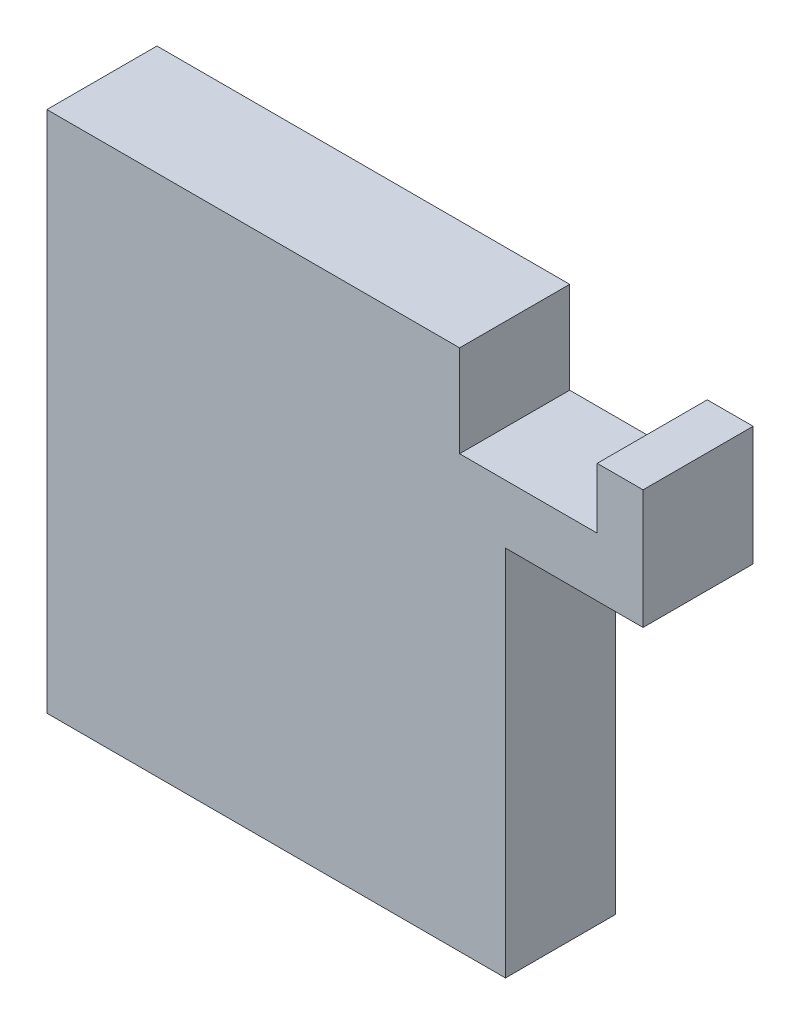
ISO-10303-21;
HEADER;
FILE_DESCRIPTION(('STEP AP214'),'2;1');
FILE_NAME('part.step','',(''),(''),'','','');
FILE_SCHEMA(('AUTOMOTIVE_DESIGN { 1 0 10303 214 1 1 1 1 }'));
ENDSEC;
DATA;
#1=APPLICATION_CONTEXT('core data for automotive mechanical design processes');
#2=APPLICATION_PROTOCOL_DEFINITION('international standard','automotive_design',2000,#1);
#3=PRODUCT_CONTEXT('',#1,'mechanical');
#4=PRODUCT('Part','Part','',(#3));
#5=PRODUCT_RELATED_PRODUCT_CATEGORY('part','',(#4));
#6=PRODUCT_DEFINITION_FORMATION('','',#4);
#7=PRODUCT_DEFINITION_CONTEXT('part definition',#1,'design');
#8=PRODUCT_DEFINITION('design','',#6,#7);
#9=PRODUCT_DEFINITION_SHAPE('','',#8);
#10=(LENGTH_UNIT() NAMED_UNIT(*) SI_UNIT(.MILLI.,.METRE.));
#11=(NAMED_UNIT(*) PLANE_ANGLE_UNIT() SI_UNIT($,.RADIAN.));
#12=(NAMED_UNIT(*) SI_UNIT($,.STERADIAN.) SOLID_ANGLE_UNIT());
#13=UNCERTAINTY_MEASURE_WITH_UNIT(LENGTH_MEASURE(1.E-05),#10,'distance_accuracy_value','');
#14=(GEOMETRIC_REPRESENTATION_CONTEXT(3) GLOBAL_UNCERTAINTY_ASSIGNED_CONTEXT((#13)) GLOBAL_UNIT_ASSIGNED_CONTEXT((#10,
#11,#12)) REPRESENTATION_CONTEXT('',''));
#15=CARTESIAN_POINT('',(0.,0.,0.));
#16=DIRECTION('',(0.,0.,1.));
#17=DIRECTION('',(1.,0.,0.));
#18=AXIS2_PLACEMENT_3D('',#15,#16,#17);
#19=CARTESIAN_POINT('',(3.4,10.5,1.2));
#20=DIRECTION('',(1.,0.,0.));
#21=DIRECTION('',(0.,1.,0.));
#22=AXIS2_PLACEMENT_3D('',#19,#20,#21);
#23=PLANE('',#22);
#24=DIRECTION('',(0.,-1.,0.));
#25=VECTOR('',#24,1.);
#26=CARTESIAN_POINT('',(3.4,10.5,0.));
#27=LINE('',#26,#25);
#28=CARTESIAN_POINT('',(3.4,10.5,0.));
#29=VERTEX_POINT('',#28);
#30=CARTESIAN_POINT('',(3.4,4.8,0.));
#31=VERTEX_POINT('',#30);
#32=EDGE_CURVE('E141',#29,#31,#27,.T.);
#33=ORIENTED_EDGE('',*,*,#32,.T.);
#34=DIRECTION('',(0.,0.,-1.));
#35=VECTOR('',#34,1.);
#36=CARTESIAN_POINT('',(3.4,4.8,1.2));
#37=LINE('',#36,#35);
#38=CARTESIAN_POINT('',(3.4,4.8,1.2));
#39=VERTEX_POINT('',#38);
#40=EDGE_CURVE('E11',#39,#31,#37,.T.);
#41=ORIENTED_EDGE('',*,*,#40,.F.);
#42=DIRECTION('',(0.,-1.,0.));
#43=VECTOR('',#42,1.);
#44=CARTESIAN_POINT('',(3.4,10.5,1.2));
#45=LINE('',#44,#43);
#46=CARTESIAN_POINT('',(3.4,10.5,1.2));
#47=VERTEX_POINT('',#46);
#48=EDGE_CURVE('E93',#47,#39,#45,.T.);
#49=ORIENTED_EDGE('',*,*,#48,.F.);
#50=DIRECTION('',(0.,0.,-1.));
#51=VECTOR('',#50,1.);
#52=CARTESIAN_POINT('',(3.4,10.5,1.2));
#53=LINE('',#52,#51);
#54=EDGE_CURVE('E50',#47,#29,#53,.T.);
#55=ORIENTED_EDGE('',*,*,#54,.T.);
#56=EDGE_LOOP('',(#33,#41,#49,#55));
#57=FACE_BOUND('',#56,.T.);
#58=ADVANCED_FACE('F34',(#57),#23,.F.);
#59=CARTESIAN_POINT('',(8.4,4.8,1.2));
#60=DIRECTION('',(0.,-1.,0.));
#61=DIRECTION('',(0.,0.,-1.));
#62=AXIS2_PLACEMENT_3D('',#59,#60,#61);
#63=PLANE('',#62);
#64=DIRECTION('',(-1.,0.,0.));
#65=VECTOR('',#64,1.);
#66=CARTESIAN_POINT('',(8.4,4.8,0.));
#67=LINE('',#66,#65);
#68=CARTESIAN_POINT('',(8.4,4.8,0.));
#69=VERTEX_POINT('',#68);
#70=EDGE_CURVE('E143',#69,#31,#67,.T.);
#71=ORIENTED_EDGE('',*,*,#70,.F.);
#72=DIRECTION('',(0.,0.,-1.));
#73=VECTOR('',#72,1.);
#74=CARTESIAN_POINT('',(8.4,4.8,1.2));
#75=LINE('',#74,#73);
#76=CARTESIAN_POINT('',(8.4,4.8,1.2));
#77=VERTEX_POINT('',#76);
#78=EDGE_CURVE('E42',#77,#69,#75,.T.);
#79=ORIENTED_EDGE('',*,*,#78,.F.);
#80=DIRECTION('',(-1.,0.,0.));
#81=VECTOR('',#80,1.);
#82=CARTESIAN_POINT('',(8.4,4.8,1.2));
#83=LINE('',#82,#81);
#84=EDGE_CURVE('E198',#77,#39,#83,.T.);
#85=ORIENTED_EDGE('',*,*,#84,.T.);
#86=ORIENTED_EDGE('',*,*,#40,.T.);
#87=EDGE_LOOP('',(#71,#79,#85,#86));
#88=FACE_BOUND('',#87,.T.);
#89=ADVANCED_FACE('F186',(#88),#63,.T.);
#90=CARTESIAN_POINT('',(8.4,8.8594615548514,1.2));
#91=DIRECTION('',(1.,0.,0.));
#92=DIRECTION('',(0.,0.,-1.));
#93=AXIS2_PLACEMENT_3D('',#90,#91,#92);
#94=PLANE('',#93);
#95=DIRECTION('',(0.,-1.,0.));
#96=VECTOR('',#95,1.);
#97=CARTESIAN_POINT('',(8.4,8.8594615548514,0.));
#98=LINE('',#97,#96);
#99=CARTESIAN_POINT('',(8.4,8.8594615548514,0.));
#100=VERTEX_POINT('',#99);
#101=EDGE_CURVE('E146',#100,#69,#98,.T.);
#102=ORIENTED_EDGE('',*,*,#101,.F.);
#103=DIRECTION('',(0.,0.,-1.));
#104=VECTOR('',#103,1.);
#105=CARTESIAN_POINT('',(8.4,8.8594615548514,1.2));
#106=LINE('',#105,#104);
#107=CARTESIAN_POINT('',(8.4,8.8594615548514,1.2));
#108=VERTEX_POINT('',#107);
#109=EDGE_CURVE('E176',#108,#100,#106,.T.);
#110=ORIENTED_EDGE('',*,*,#109,.F.);
#111=DIRECTION('',(0.,-1.,0.));
#112=VECTOR('',#111,1.);
#113=CARTESIAN_POINT('',(8.4,8.8594615548514,1.2));
#114=LINE('',#113,#112);
#115=EDGE_CURVE('E183',#108,#77,#114,.T.);
#116=ORIENTED_EDGE('',*,*,#115,.T.);
#117=ORIENTED_EDGE('',*,*,#78,.T.);
#118=EDGE_LOOP('',(#102,#110,#116,#117));
#119=FACE_BOUND('',#118,.T.);
#120=ADVANCED_FACE('F181',(#119),#94,.T.);
#121=CARTESIAN_POINT('',(9.9,8.8594615548514,1.2));
#122=DIRECTION('',(0.,-1.,0.));
#123=DIRECTION('',(0.,0.,-1.));
#124=AXIS2_PLACEMENT_3D('',#121,#122,#123);
#125=PLANE('',#124);
#126=DIRECTION('',(-1.,0.,0.));
#127=VECTOR('',#126,1.);
#128=CARTESIAN_POINT('',(9.9,8.8594615548514,0.));
#129=LINE('',#128,#127);
#130=CARTESIAN_POINT('',(9.9,8.8594615548514,0.));
#131=VERTEX_POINT('',#130);
#132=EDGE_CURVE('E149',#131,#100,#129,.T.);
#133=ORIENTED_EDGE('',*,*,#132,.F.);
#134=DIRECTION('',(0.,0.,-1.));
#135=VECTOR('',#134,1.);
#136=CARTESIAN_POINT('',(9.9,8.8594615548514,1.2));
#137=LINE('',#136,#135);
#138=CARTESIAN_POINT('',(9.9,8.8594615548514,1.2));
#139=VERTEX_POINT('',#138);
#140=EDGE_CURVE('E174',#139,#131,#137,.T.);
#141=ORIENTED_EDGE('',*,*,#140,.F.);
#142=DIRECTION('',(-1.,0.,0.));
#143=VECTOR('',#142,1.);
#144=CARTESIAN_POINT('',(9.9,8.8594615548514,1.2));
#145=LINE('',#144,#143);
#146=EDGE_CURVE('E195',#139,#108,#145,.T.);
#147=ORIENTED_EDGE('',*,*,#146,.T.);
#148=ORIENTED_EDGE('',*,*,#109,.T.);
#149=EDGE_LOOP('',(#133,#141,#147,#148));
#150=FACE_BOUND('',#149,.T.);
#151=ADVANCED_FACE('F192',(#150),#125,.T.);
#152=CARTESIAN_POINT('',(9.9,10.1594615548514,1.2));
#153=DIRECTION('',(1.,0.,0.));
#154=DIRECTION('',(0.,0.,-1.));
#155=AXIS2_PLACEMENT_3D('',#152,#153,#154);
#156=PLANE('',#155);
#157=DIRECTION('',(0.,-1.,0.));
#158=VECTOR('',#157,1.);
#159=CARTESIAN_POINT('',(9.9,10.1594615548514,0.));
#160=LINE('',#159,#158);
#161=CARTESIAN_POINT('',(9.9,10.1594615548514,0.));
#162=VERTEX_POINT('',#161);
#163=EDGE_CURVE('E152',#162,#131,#160,.T.);
#164=ORIENTED_EDGE('',*,*,#163,.F.);
#165=DIRECTION('',(0.,0.,-1.));
#166=VECTOR('',#165,1.);
#167=CARTESIAN_POINT('',(9.9,10.1594615548514,1.2));
#168=LINE('',#167,#166);
#169=CARTESIAN_POINT('',(9.9,10.1594615548514,1.2));
#170=VERTEX_POINT('',#169);
#171=EDGE_CURVE('E172',#170,#162,#168,.T.);
#172=ORIENTED_EDGE('',*,*,#171,.F.);
#173=DIRECTION('',(0.,-1.,0.));
#174=VECTOR('',#173,1.);
#175=CARTESIAN_POINT('',(9.9,10.1594615548514,1.2));
#176=LINE('',#175,#174);
#177=EDGE_CURVE('E200',#170,#139,#176,.T.);
#178=ORIENTED_EDGE('',*,*,#177,.T.);
#179=ORIENTED_EDGE('',*,*,#140,.T.);
#180=EDGE_LOOP('',(#164,#172,#178,#179));
#181=FACE_BOUND('',#180,.T.);
#182=ADVANCED_FACE('F233',(#181),#156,.T.);
#183=CARTESIAN_POINT('',(9.4,10.1594615548514,1.2));
#184=DIRECTION('',(0.,1.,0.));
#185=DIRECTION('',(0.,0.,1.));
#186=AXIS2_PLACEMENT_3D('',#183,#184,#185);
#187=PLANE('',#186);
#188=DIRECTION('',(1.,0.,0.));
#189=VECTOR('',#188,1.);
#190=CARTESIAN_POINT('',(9.4,10.1594615548514,0.));
#191=LINE('',#190,#189);
#192=CARTESIAN_POINT('',(9.4,10.1594615548514,0.));
#193=VERTEX_POINT('',#192);
#194=EDGE_CURVE('E155',#193,#162,#191,.T.);
#195=ORIENTED_EDGE('',*,*,#194,.F.);
#196=DIRECTION('',(0.,0.,-1.));
#197=VECTOR('',#196,1.);
#198=CARTESIAN_POINT('',(9.4,10.1594615548514,1.2));
#199=LINE('',#198,#197);
#200=CARTESIAN_POINT('',(9.4,10.1594615548514,1.2));
#201=VERTEX_POINT('',#200);
#202=EDGE_CURVE('E170',#201,#193,#199,.T.);
#203=ORIENTED_EDGE('',*,*,#202,.F.);
#204=DIRECTION('',(1.,0.,0.));
#205=VECTOR('',#204,1.);
#206=CARTESIAN_POINT('',(9.4,10.1594615548514,1.2));
#207=LINE('',#206,#205);
#208=EDGE_CURVE('E206',#201,#170,#207,.T.);
#209=ORIENTED_EDGE('',*,*,#208,.T.);
#210=ORIENTED_EDGE('',*,*,#171,.T.);
#211=EDGE_LOOP('',(#195,#203,#209,#210));
#212=FACE_BOUND('',#211,.T.);
#213=ADVANCED_FACE('F236',(#212),#187,.T.);
#214=CARTESIAN_POINT('',(9.4,9.50000000000002,1.2));
#215=DIRECTION('',(-1.,0.,0.));
#216=DIRECTION('',(0.,0.,1.));
#217=AXIS2_PLACEMENT_3D('',#214,#215,#216);
#218=PLANE('',#217);
#219=DIRECTION('',(0.,1.,0.));
#220=VECTOR('',#219,1.);
#221=CARTESIAN_POINT('',(9.4,9.50000000000002,0.));
#222=LINE('',#221,#220);
#223=CARTESIAN_POINT('',(9.4,9.50000000000002,0.));
#224=VERTEX_POINT('',#223);
#225=EDGE_CURVE('E158',#224,#193,#222,.T.);
#226=ORIENTED_EDGE('',*,*,#225,.F.);
#227=DIRECTION('',(0.,0.,-1.));
#228=VECTOR('',#227,1.);
#229=CARTESIAN_POINT('',(9.4,9.50000000000002,1.2));
#230=LINE('',#229,#228);
#231=CARTESIAN_POINT('',(9.4,9.50000000000002,1.2));
#232=VERTEX_POINT('',#231);
#233=EDGE_CURVE('E125',#232,#224,#230,.T.);
#234=ORIENTED_EDGE('',*,*,#233,.F.);
#235=DIRECTION('',(0.,1.,0.));
#236=VECTOR('',#235,1.);
#237=CARTESIAN_POINT('',(9.4,9.50000000000002,1.2));
#238=LINE('',#237,#236);
#239=EDGE_CURVE('E133',#232,#201,#238,.T.);
#240=ORIENTED_EDGE('',*,*,#239,.T.);
#241=ORIENTED_EDGE('',*,*,#202,.T.);
#242=EDGE_LOOP('',(#226,#234,#240,#241));
#243=FACE_BOUND('',#242,.T.);
#244=ADVANCED_FACE('F210',(#243),#218,.T.);
#245=CARTESIAN_POINT('',(7.9,9.50000000000002,1.2));
#246=DIRECTION('',(0.,1.,0.));
#247=DIRECTION('',(0.,0.,1.));
#248=AXIS2_PLACEMENT_3D('',#245,#246,#247);
#249=PLANE('',#248);
#250=DIRECTION('',(1.,0.,0.));
#251=VECTOR('',#250,1.);
#252=CARTESIAN_POINT('',(7.9,9.50000000000002,0.));
#253=LINE('',#252,#251);
#254=CARTESIAN_POINT('',(7.9,9.50000000000002,0.));
#255=VERTEX_POINT('',#254);
#256=EDGE_CURVE('E121',#255,#224,#253,.T.);
#257=ORIENTED_EDGE('',*,*,#256,.F.);
#258=DIRECTION('',(0.,0.,-1.));
#259=VECTOR('',#258,1.);
#260=CARTESIAN_POINT('',(7.9,9.50000000000002,1.2));
#261=LINE('',#260,#259);
#262=CARTESIAN_POINT('',(7.9,9.50000000000002,1.2));
#263=VERTEX_POINT('',#262);
#264=EDGE_CURVE('E116',#263,#255,#261,.T.);
#265=ORIENTED_EDGE('',*,*,#264,.F.);
#266=DIRECTION('',(1.,0.,0.));
#267=VECTOR('',#266,1.);
#268=CARTESIAN_POINT('',(7.9,9.50000000000002,1.2));
#269=LINE('',#268,#267);
#270=EDGE_CURVE('E119',#263,#232,#269,.T.);
#271=ORIENTED_EDGE('',*,*,#270,.T.);
#272=ORIENTED_EDGE('',*,*,#233,.T.);
#273=EDGE_LOOP('',(#257,#265,#271,#272));
#274=FACE_BOUND('',#273,.T.);
#275=ADVANCED_FACE('F118',(#274),#249,.T.);
#276=CARTESIAN_POINT('',(7.9,10.5,1.2));
#277=DIRECTION('',(1.,0.,0.));
#278=DIRECTION('',(0.,0.,-1.));
#279=AXIS2_PLACEMENT_3D('',#276,#277,#278);
#280=PLANE('',#279);
#281=DIRECTION('',(0.,-1.,0.));
#282=VECTOR('',#281,1.);
#283=CARTESIAN_POINT('',(7.9,10.5,0.));
#284=LINE('',#283,#282);
#285=CARTESIAN_POINT('',(7.9,10.5,0.));
#286=VERTEX_POINT('',#285);
#287=EDGE_CURVE('E162',#286,#255,#284,.T.);
#288=ORIENTED_EDGE('',*,*,#287,.F.);
#289=DIRECTION('',(0.,0.,-1.));
#290=VECTOR('',#289,1.);
#291=CARTESIAN_POINT('',(7.9,10.5,1.2));
#292=LINE('',#291,#290);
#293=CARTESIAN_POINT('',(7.9,10.5,1.2));
#294=VERTEX_POINT('',#293);
#295=EDGE_CURVE('E81',#294,#286,#292,.T.);
#296=ORIENTED_EDGE('',*,*,#295,.F.);
#297=DIRECTION('',(0.,-1.,0.));
#298=VECTOR('',#297,1.);
#299=CARTESIAN_POINT('',(7.9,10.5,1.2));
#300=LINE('',#299,#298);
#301=EDGE_CURVE('E130',#294,#263,#300,.T.);
#302=ORIENTED_EDGE('',*,*,#301,.T.);
#303=ORIENTED_EDGE('',*,*,#264,.T.);
#304=EDGE_LOOP('',(#288,#296,#302,#303));
#305=FACE_BOUND('',#304,.T.);
#306=ADVANCED_FACE('F135',(#305),#280,.T.);
#307=CARTESIAN_POINT('',(3.4,10.5,1.2));
#308=DIRECTION('',(0.,1.,0.));
#309=DIRECTION('',(0.,0.,1.));
#310=AXIS2_PLACEMENT_3D('',#307,#308,#309);
#311=PLANE('',#310);
#312=DIRECTION('',(1.,0.,0.));
#313=VECTOR('',#312,1.);
#314=CARTESIAN_POINT('',(3.4,10.5,0.));
#315=LINE('',#314,#313);
#316=EDGE_CURVE('E164',#29,#286,#315,.T.);
#317=ORIENTED_EDGE('',*,*,#316,.F.);
#318=ORIENTED_EDGE('',*,*,#54,.F.);
#319=DIRECTION('',(1.,0.,0.));
#320=VECTOR('',#319,1.);
#321=CARTESIAN_POINT('',(3.4,10.5,1.2));
#322=LINE('',#321,#320);
#323=EDGE_CURVE('E136',#47,#294,#322,.T.);
#324=ORIENTED_EDGE('',*,*,#323,.T.);
#325=ORIENTED_EDGE('',*,*,#295,.T.);
#326=EDGE_LOOP('',(#317,#318,#324,#325));
#327=FACE_BOUND('',#326,.T.);
#328=ADVANCED_FACE('F212',(#327),#311,.T.);
#329=CARTESIAN_POINT('',(0.,0.,1.2));
#330=DIRECTION('',(0.,0.,-1.));
#331=DIRECTION('',(-1.,0.,0.));
#332=AXIS2_PLACEMENT_3D('',#329,#330,#331);
#333=PLANE('',#332);
#334=ORIENTED_EDGE('',*,*,#48,.T.);
#335=ORIENTED_EDGE('',*,*,#84,.F.);
#336=ORIENTED_EDGE('',*,*,#115,.F.);
#337=ORIENTED_EDGE('',*,*,#146,.F.);
#338=ORIENTED_EDGE('',*,*,#177,.F.);
#339=ORIENTED_EDGE('',*,*,#208,.F.);
#340=ORIENTED_EDGE('',*,*,#239,.F.);
#341=ORIENTED_EDGE('',*,*,#270,.F.);
#342=ORIENTED_EDGE('',*,*,#301,.F.);
#343=ORIENTED_EDGE('',*,*,#323,.F.);
#344=EDGE_LOOP('',(#334,#335,#336,#337,#338,#339,#340,#341,#342,#343));
#345=FACE_BOUND('',#344,.T.);
#346=ADVANCED_FACE('F129',(#345),#333,.F.);
#347=CARTESIAN_POINT('',(0.,0.,0.));
#348=DIRECTION('',(0.,0.,-1.));
#349=DIRECTION('',(-1.,0.,0.));
#350=AXIS2_PLACEMENT_3D('',#347,#348,#349);
#351=PLANE('',#350);
#352=ORIENTED_EDGE('',*,*,#32,.F.);
#353=ORIENTED_EDGE('',*,*,#316,.T.);
#354=ORIENTED_EDGE('',*,*,#287,.T.);
#355=ORIENTED_EDGE('',*,*,#256,.T.);
#356=ORIENTED_EDGE('',*,*,#225,.T.);
#357=ORIENTED_EDGE('',*,*,#194,.T.);
#358=ORIENTED_EDGE('',*,*,#163,.T.);
#359=ORIENTED_EDGE('',*,*,#132,.T.);
#360=ORIENTED_EDGE('',*,*,#101,.T.);
#361=ORIENTED_EDGE('',*,*,#70,.T.);
#362=EDGE_LOOP('',(#352,#353,#354,#355,#356,#357,#358,#359,#360,#361));
#363=FACE_BOUND('',#362,.T.);
#364=ADVANCED_FACE('F188',(#363),#351,.T.);
#365=CLOSED_SHELL('',(#58,#89,#120,#151,#182,#213,#244,#275,#306,#328,#346,#364));
#366=MANIFOLD_SOLID_BREP('B2',#365);
#367=ADVANCED_BREP_SHAPE_REPRESENTATION('',(#18,#366),#14);
#368=SHAPE_DEFINITION_REPRESENTATION(#9,#367);
ENDSEC;
END-ISO-10303-21;
